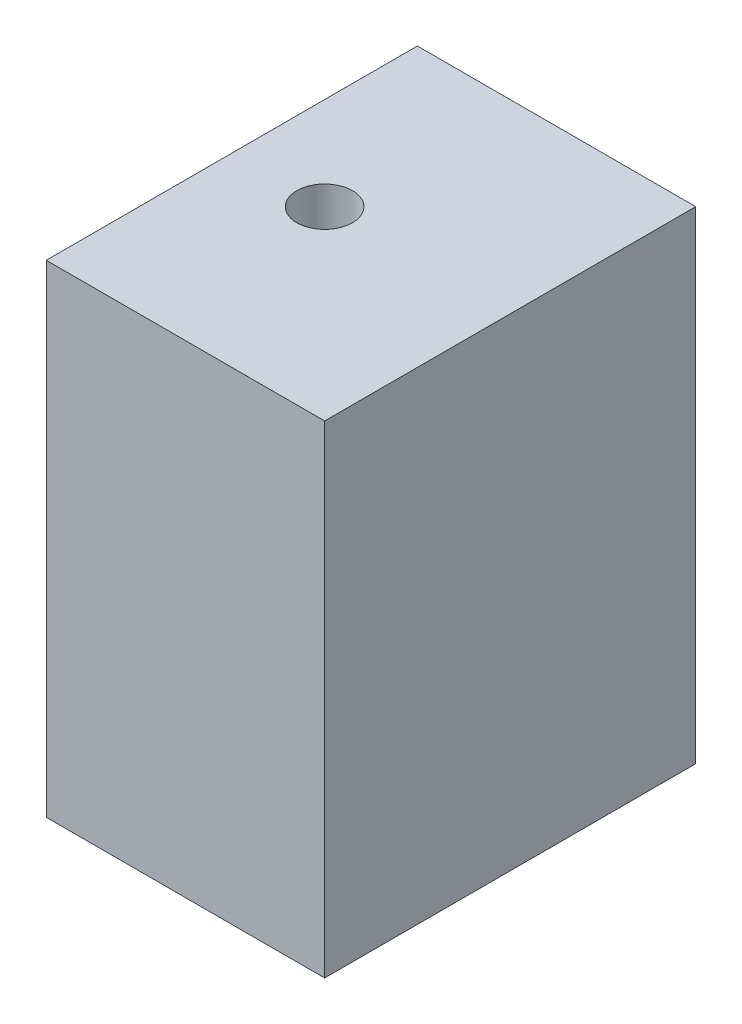
ISO-10303-21;
HEADER;
FILE_DESCRIPTION(('STEP AP214'),'2;1');
FILE_NAME('part.step','',(''),(''),'','','');
FILE_SCHEMA(('AUTOMOTIVE_DESIGN { 1 0 10303 214 1 1 1 1 }'));
ENDSEC;
DATA;
#1=APPLICATION_CONTEXT('core data for automotive mechanical design processes');
#2=APPLICATION_PROTOCOL_DEFINITION('international standard','automotive_design',2000,#1);
#3=PRODUCT_CONTEXT('',#1,'mechanical');
#4=PRODUCT('Part','Part','',(#3));
#5=PRODUCT_RELATED_PRODUCT_CATEGORY('part','',(#4));
#6=PRODUCT_DEFINITION_FORMATION('','',#4);
#7=PRODUCT_DEFINITION_CONTEXT('part definition',#1,'design');
#8=PRODUCT_DEFINITION('design','',#6,#7);
#9=PRODUCT_DEFINITION_SHAPE('','',#8);
#10=(LENGTH_UNIT() NAMED_UNIT(*) SI_UNIT(.MILLI.,.METRE.));
#11=(NAMED_UNIT(*) PLANE_ANGLE_UNIT() SI_UNIT($,.RADIAN.));
#12=(NAMED_UNIT(*) SI_UNIT($,.STERADIAN.) SOLID_ANGLE_UNIT());
#13=UNCERTAINTY_MEASURE_WITH_UNIT(LENGTH_MEASURE(1.E-05),#10,'distance_accuracy_value','');
#14=(GEOMETRIC_REPRESENTATION_CONTEXT(3) GLOBAL_UNCERTAINTY_ASSIGNED_CONTEXT((#13)) GLOBAL_UNIT_ASSIGNED_CONTEXT((#10,
#11,#12)) REPRESENTATION_CONTEXT('',''));
#15=CARTESIAN_POINT('',(0.,0.,0.));
#16=DIRECTION('',(0.,0.,1.));
#17=DIRECTION('',(1.,0.,0.));
#18=AXIS2_PLACEMENT_3D('',#15,#16,#17);
#19=CARTESIAN_POINT('',(7.5,26.,-10.));
#20=DIRECTION('',(-1.,0.,0.));
#21=DIRECTION('',(0.,0.,1.));
#22=AXIS2_PLACEMENT_3D('',#19,#20,#21);
#23=PLANE('',#22);
#24=DIRECTION('',(0.,0.,-1.));
#25=VECTOR('',#24,1.);
#26=CARTESIAN_POINT('',(7.5,0.,-10.));
#27=LINE('',#26,#25);
#28=CARTESIAN_POINT('',(7.5,0.,10.));
#29=VERTEX_POINT('',#28);
#30=CARTESIAN_POINT('',(7.5,0.,-10.));
#31=VERTEX_POINT('',#30);
#32=EDGE_CURVE('E108',#29,#31,#27,.T.);
#33=ORIENTED_EDGE('',*,*,#32,.T.);
#34=DIRECTION('',(0.,-1.,0.));
#35=VECTOR('',#34,1.);
#36=CARTESIAN_POINT('',(7.5,26.,-10.));
#37=LINE('',#36,#35);
#38=CARTESIAN_POINT('',(7.5,26.,-10.));
#39=VERTEX_POINT('',#38);
#40=EDGE_CURVE('E11',#39,#31,#37,.T.);
#41=ORIENTED_EDGE('',*,*,#40,.F.);
#42=DIRECTION('',(0.,0.,-1.));
#43=VECTOR('',#42,1.);
#44=CARTESIAN_POINT('',(7.5,26.,-10.));
#45=LINE('',#44,#43);
#46=CARTESIAN_POINT('',(7.5,26.,10.));
#47=VERTEX_POINT('',#46);
#48=EDGE_CURVE('E96',#47,#39,#45,.T.);
#49=ORIENTED_EDGE('',*,*,#48,.F.);
#50=DIRECTION('',(0.,-1.,0.));
#51=VECTOR('',#50,1.);
#52=CARTESIAN_POINT('',(7.5,26.,10.));
#53=LINE('',#52,#51);
#54=EDGE_CURVE('E104',#47,#29,#53,.T.);
#55=ORIENTED_EDGE('',*,*,#54,.T.);
#56=EDGE_LOOP('',(#33,#41,#49,#55));
#57=FACE_BOUND('',#56,.T.);
#58=ADVANCED_FACE('F41',(#57),#23,.F.);
#59=CARTESIAN_POINT('',(-7.5,26.,-10.));
#60=DIRECTION('',(0.,0.,1.));
#61=DIRECTION('',(1.,0.,0.));
#62=AXIS2_PLACEMENT_3D('',#59,#60,#61);
#63=PLANE('',#62);
#64=DIRECTION('',(-1.,0.,0.));
#65=VECTOR('',#64,1.);
#66=CARTESIAN_POINT('',(-7.5,0.,-10.));
#67=LINE('',#66,#65);
#68=CARTESIAN_POINT('',(-7.5,0.,-10.));
#69=VERTEX_POINT('',#68);
#70=EDGE_CURVE('E99',#31,#69,#67,.T.);
#71=ORIENTED_EDGE('',*,*,#70,.T.);
#72=DIRECTION('',(0.,-1.,0.));
#73=VECTOR('',#72,1.);
#74=CARTESIAN_POINT('',(-7.5,26.,-10.));
#75=LINE('',#74,#73);
#76=CARTESIAN_POINT('',(-7.5,26.,-10.));
#77=VERTEX_POINT('',#76);
#78=EDGE_CURVE('E55',#77,#69,#75,.T.);
#79=ORIENTED_EDGE('',*,*,#78,.F.);
#80=DIRECTION('',(-1.,0.,0.));
#81=VECTOR('',#80,1.);
#82=CARTESIAN_POINT('',(-7.5,26.,-10.));
#83=LINE('',#82,#81);
#84=EDGE_CURVE('E93',#39,#77,#83,.T.);
#85=ORIENTED_EDGE('',*,*,#84,.F.);
#86=ORIENTED_EDGE('',*,*,#40,.T.);
#87=EDGE_LOOP('',(#71,#79,#85,#86));
#88=FACE_BOUND('',#87,.T.);
#89=ADVANCED_FACE('F97',(#88),#63,.F.);
#90=CARTESIAN_POINT('',(-7.5,26.,-10.));
#91=DIRECTION('',(1.,0.,0.));
#92=DIRECTION('',(0.,0.,-1.));
#93=AXIS2_PLACEMENT_3D('',#90,#91,#92);
#94=PLANE('',#93);
#95=DIRECTION('',(0.,0.,1.));
#96=VECTOR('',#95,1.);
#97=CARTESIAN_POINT('',(-7.5,0.,-10.));
#98=LINE('',#97,#96);
#99=CARTESIAN_POINT('',(-7.5,0.,10.));
#100=VERTEX_POINT('',#99);
#101=EDGE_CURVE('E79',#69,#100,#98,.T.);
#102=ORIENTED_EDGE('',*,*,#101,.T.);
#103=DIRECTION('',(0.,-1.,0.));
#104=VECTOR('',#103,1.);
#105=CARTESIAN_POINT('',(-7.5,26.,10.));
#106=LINE('',#105,#104);
#107=CARTESIAN_POINT('',(-7.5,26.,10.));
#108=VERTEX_POINT('',#107);
#109=EDGE_CURVE('E101',#108,#100,#106,.T.);
#110=ORIENTED_EDGE('',*,*,#109,.F.);
#111=DIRECTION('',(0.,0.,1.));
#112=VECTOR('',#111,1.);
#113=CARTESIAN_POINT('',(-7.5,26.,-10.));
#114=LINE('',#113,#112);
#115=EDGE_CURVE('E94',#77,#108,#114,.T.);
#116=ORIENTED_EDGE('',*,*,#115,.F.);
#117=ORIENTED_EDGE('',*,*,#78,.T.);
#118=EDGE_LOOP('',(#102,#110,#116,#117));
#119=FACE_BOUND('',#118,.T.);
#120=ADVANCED_FACE('F103',(#119),#94,.F.);
#121=CARTESIAN_POINT('',(-7.5,26.,10.));
#122=DIRECTION('',(0.,0.,-1.));
#123=DIRECTION('',(-1.,0.,0.));
#124=AXIS2_PLACEMENT_3D('',#121,#122,#123);
#125=PLANE('',#124);
#126=DIRECTION('',(1.,0.,0.));
#127=VECTOR('',#126,1.);
#128=CARTESIAN_POINT('',(-7.5,0.,10.));
#129=LINE('',#128,#127);
#130=EDGE_CURVE('E83',#100,#29,#129,.T.);
#131=ORIENTED_EDGE('',*,*,#130,.T.);
#132=ORIENTED_EDGE('',*,*,#54,.F.);
#133=DIRECTION('',(1.,0.,0.));
#134=VECTOR('',#133,1.);
#135=CARTESIAN_POINT('',(-7.5,26.,10.));
#136=LINE('',#135,#134);
#137=EDGE_CURVE('E61',#108,#47,#136,.T.);
#138=ORIENTED_EDGE('',*,*,#137,.F.);
#139=ORIENTED_EDGE('',*,*,#109,.T.);
#140=EDGE_LOOP('',(#131,#132,#138,#139));
#141=FACE_BOUND('',#140,.T.);
#142=ADVANCED_FACE('F145',(#141),#125,.F.);
#143=CARTESIAN_POINT('',(0.,26.,0.));
#144=DIRECTION('',(0.,1.,0.));
#145=DIRECTION('',(0.,0.,1.));
#146=AXIS2_PLACEMENT_3D('',#143,#144,#145);
#147=PLANE('',#146);
#148=CARTESIAN_POINT('',(-2.50000000000017,26.000012,0.));
#149=DIRECTION('',(0.,1.,0.));
#150=DIRECTION('',(0.,0.,1.));
#151=AXIS2_PLACEMENT_3D('',#148,#149,#150);
#152=CIRCLE('',#151,1.49999999999815);
#153=CARTESIAN_POINT('',(-2.50000000000017,26.000012,1.4999999999981));
#154=VERTEX_POINT('',#153);
#155=EDGE_CURVE('E120',#154,#154,#152,.T.);
#156=ORIENTED_EDGE('',*,*,#155,.F.);
#157=EDGE_LOOP('',(#156));
#158=FACE_BOUND('',#157,.T.);
#159=ORIENTED_EDGE('',*,*,#48,.T.);
#160=ORIENTED_EDGE('',*,*,#84,.T.);
#161=ORIENTED_EDGE('',*,*,#115,.T.);
#162=ORIENTED_EDGE('',*,*,#137,.T.);
#163=EDGE_LOOP('',(#159,#160,#161,#162));
#164=FACE_BOUND('',#163,.T.);
#165=ADVANCED_FACE('F95',(#158,#164),#147,.T.);
#166=CARTESIAN_POINT('',(0.,0.,0.));
#167=DIRECTION('',(0.,1.,0.));
#168=DIRECTION('',(0.,0.,1.));
#169=AXIS2_PLACEMENT_3D('',#166,#167,#168);
#170=PLANE('',#169);
#171=CARTESIAN_POINT('',(-2.50000000000017,0.,0.));
#172=DIRECTION('',(0.,1.,0.));
#173=DIRECTION('',(0.,0.,1.));
#174=AXIS2_PLACEMENT_3D('',#171,#172,#173);
#175=CIRCLE('',#174,1.49999999999815);
#176=CARTESIAN_POINT('',(-2.50000000000017,0.,1.4999999999981));
#177=VERTEX_POINT('',#176);
#178=EDGE_CURVE('E115',#177,#177,#175,.T.);
#179=ORIENTED_EDGE('',*,*,#178,.T.);
#180=EDGE_LOOP('',(#179));
#181=FACE_BOUND('',#180,.T.);
#182=ORIENTED_EDGE('',*,*,#32,.F.);
#183=ORIENTED_EDGE('',*,*,#130,.F.);
#184=ORIENTED_EDGE('',*,*,#101,.F.);
#185=ORIENTED_EDGE('',*,*,#70,.F.);
#186=EDGE_LOOP('',(#182,#183,#184,#185));
#187=FACE_BOUND('',#186,.T.);
#188=ADVANCED_FACE('F138',(#181,#187),#170,.F.);
#189=CARTESIAN_POINT('',(-2.50000000000017,0.,0.));
#190=DIRECTION('',(0.,1.,0.));
#191=DIRECTION('',(0.,0.,1.));
#192=AXIS2_PLACEMENT_3D('',#189,#190,#191);
#193=CYLINDRICAL_SURFACE('',#192,1.49999999999815);
#194=ORIENTED_EDGE('',*,*,#178,.F.);
#195=EDGE_LOOP('',(#194));
#196=FACE_BOUND('',#195,.T.);
#197=ORIENTED_EDGE('',*,*,#155,.T.);
#198=EDGE_LOOP('',(#197));
#199=FACE_BOUND('',#198,.T.);
#200=ADVANCED_FACE('F131',(#196,#199),#193,.F.);
#201=CLOSED_SHELL('',(#58,#89,#120,#142,#165,#188,#200));
#202=MANIFOLD_SOLID_BREP('B2',#201);
#203=ADVANCED_BREP_SHAPE_REPRESENTATION('',(#18,#202),#14);
#204=SHAPE_DEFINITION_REPRESENTATION(#9,#203);
ENDSEC;
END-ISO-10303-21;
